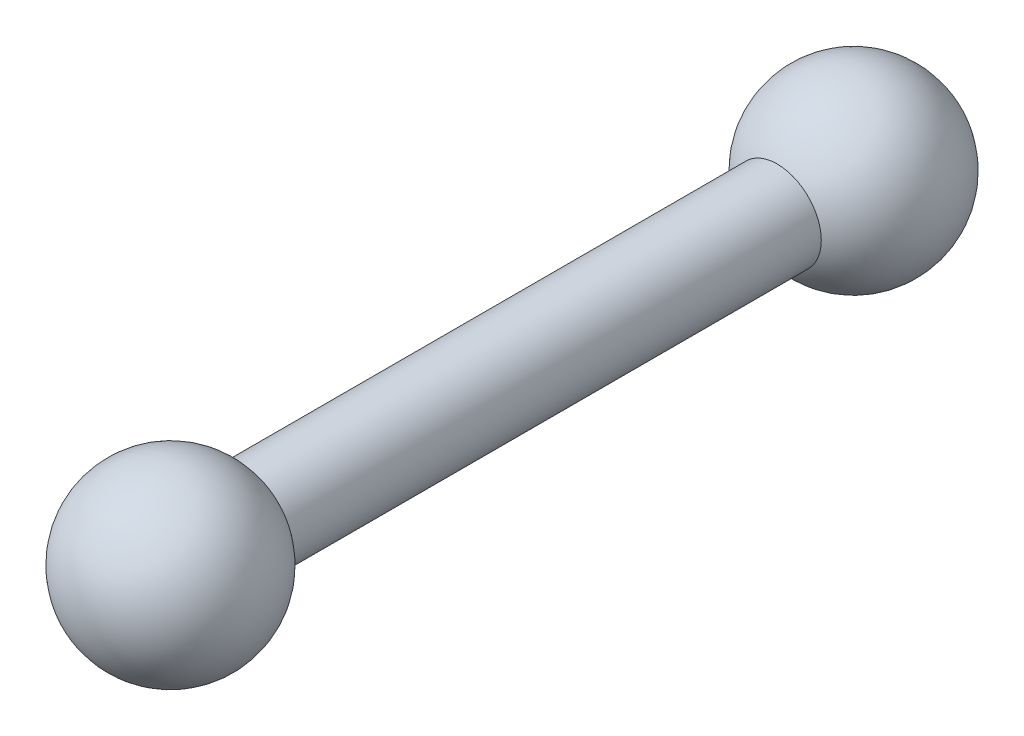
ISO-10303-21;
HEADER;
FILE_DESCRIPTION(('STEP AP214'),'2;1');
FILE_NAME('part.step','',(''),(''),'','','');
FILE_SCHEMA(('AUTOMOTIVE_DESIGN { 1 0 10303 214 1 1 1 1 }'));
ENDSEC;
DATA;
#1=APPLICATION_CONTEXT('core data for automotive mechanical design processes');
#2=APPLICATION_PROTOCOL_DEFINITION('international standard','automotive_design',2000,#1);
#3=PRODUCT_CONTEXT('',#1,'mechanical');
#4=PRODUCT('Part','Part','',(#3));
#5=PRODUCT_RELATED_PRODUCT_CATEGORY('part','',(#4));
#6=PRODUCT_DEFINITION_FORMATION('','',#4);
#7=PRODUCT_DEFINITION_CONTEXT('part definition',#1,'design');
#8=PRODUCT_DEFINITION('design','',#6,#7);
#9=PRODUCT_DEFINITION_SHAPE('','',#8);
#10=(LENGTH_UNIT() NAMED_UNIT(*) SI_UNIT(.MILLI.,.METRE.));
#11=(NAMED_UNIT(*) PLANE_ANGLE_UNIT() SI_UNIT($,.RADIAN.));
#12=(NAMED_UNIT(*) SI_UNIT($,.STERADIAN.) SOLID_ANGLE_UNIT());
#13=UNCERTAINTY_MEASURE_WITH_UNIT(LENGTH_MEASURE(1.E-05),#10,'distance_accuracy_value','');
#14=(GEOMETRIC_REPRESENTATION_CONTEXT(3) GLOBAL_UNCERTAINTY_ASSIGNED_CONTEXT((#13)) GLOBAL_UNIT_ASSIGNED_CONTEXT((#10,
#11,#12)) REPRESENTATION_CONTEXT('',''));
#15=CARTESIAN_POINT('',(0.,0.,0.));
#16=DIRECTION('',(0.,0.,1.));
#17=DIRECTION('',(1.,0.,0.));
#18=AXIS2_PLACEMENT_3D('',#15,#16,#17);
#19=CARTESIAN_POINT('',(0.,0.,-28.));
#20=DIRECTION('',(0.,1.,0.));
#21=DIRECTION('',(1.,0.,0.));
#22=AXIS2_PLACEMENT_3D('',#19,#20,#21);
#23=SPHERICAL_SURFACE('',#22,4.);
#24=CARTESIAN_POINT('',(0.,0.,-28.));
#25=DIRECTION('',(0.,0.,-1.));
#26=DIRECTION('',(-1.,0.,0.));
#27=AXIS2_PLACEMENT_3D('',#24,#25,#26);
#28=SPHERICAL_SURFACE('',#27,4.);
#29=CARTESIAN_POINT('',(0.,0.,-24.5358983848622));
#30=DIRECTION('',(0.,0.,-1.));
#31=DIRECTION('',(-1.,0.,0.));
#32=AXIS2_PLACEMENT_3D('',#29,#30,#31);
#33=CIRCLE('',#32,2.);
#34=CARTESIAN_POINT('',(-2.,0.,-24.5358983848622));
#35=VERTEX_POINT('',#34);
#36=EDGE_CURVE('E41',#35,#35,#33,.F.);
#37=ORIENTED_EDGE('',*,*,#36,.F.);
#38=EDGE_LOOP('',(#37));
#39=FACE_BOUND('',#38,.T.);
#40=ADVANCED_FACE('F37',(#39),#28,.T.);
#41=CARTESIAN_POINT('',(0.,0.,-25.));
#42=DIRECTION('',(0.,0.,1.));
#43=DIRECTION('',(1.,0.,0.));
#44=AXIS2_PLACEMENT_3D('',#41,#42,#43);
#45=CYLINDRICAL_SURFACE('',#44,2.);
#46=CARTESIAN_POINT('',(0.,0.,-0.464101615137756));
#47=DIRECTION('',(0.,0.,1.));
#48=DIRECTION('',(1.,0.,0.));
#49=AXIS2_PLACEMENT_3D('',#46,#47,#48);
#50=CIRCLE('',#49,2.);
#51=CARTESIAN_POINT('',(2.,0.,-0.464101615137756));
#52=VERTEX_POINT('',#51);
#53=EDGE_CURVE('E10',#52,#52,#50,.F.);
#54=ORIENTED_EDGE('',*,*,#53,.T.);
#55=EDGE_LOOP('',(#54));
#56=FACE_BOUND('',#55,.T.);
#57=ORIENTED_EDGE('',*,*,#36,.T.);
#58=EDGE_LOOP('',(#57));
#59=FACE_BOUND('',#58,.T.);
#60=ADVANCED_FACE('F39',(#56,#59),#45,.T.);
#61=CARTESIAN_POINT('',(0.,0.,3.));
#62=DIRECTION('',(0.,1.,0.));
#63=DIRECTION('',(1.,0.,0.));
#64=AXIS2_PLACEMENT_3D('',#61,#62,#63);
#65=SPHERICAL_SURFACE('',#64,4.);
#66=CARTESIAN_POINT('',(0.,0.,3.));
#67=DIRECTION('',(0.,0.,1.));
#68=DIRECTION('',(1.,0.,0.));
#69=AXIS2_PLACEMENT_3D('',#66,#67,#68);
#70=SPHERICAL_SURFACE('',#69,4.);
#71=ORIENTED_EDGE('',*,*,#53,.F.);
#72=EDGE_LOOP('',(#71));
#73=FACE_BOUND('',#72,.T.);
#74=ADVANCED_FACE('F58',(#73),#70,.T.);
#75=CLOSED_SHELL('',(#40,#60,#74));
#76=MANIFOLD_SOLID_BREP('B2',#75);
#77=ADVANCED_BREP_SHAPE_REPRESENTATION('',(#18,#76),#14);
#78=SHAPE_DEFINITION_REPRESENTATION(#9,#77);
ENDSEC;
END-ISO-10303-21;
